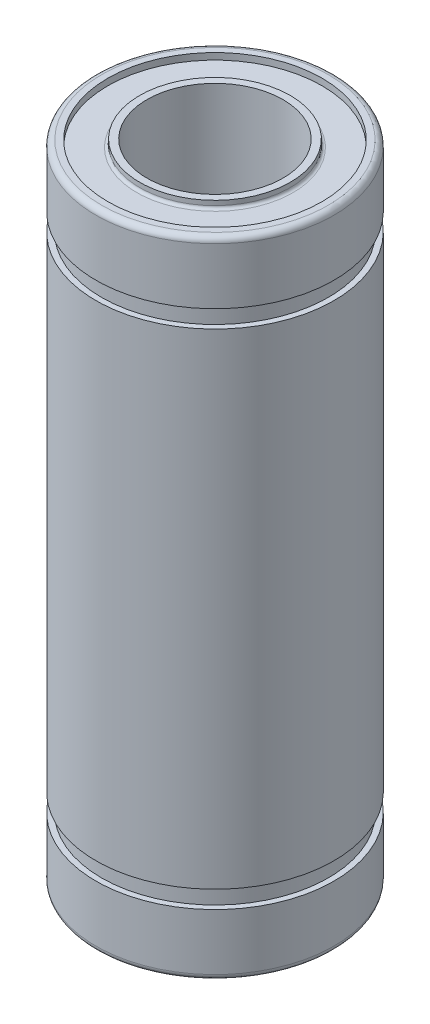
ISO-10303-21;
HEADER;
FILE_DESCRIPTION(('STEP AP214'),'2;1');
FILE_NAME('part.step','',(''),(''),'','','');
FILE_SCHEMA(('AUTOMOTIVE_DESIGN { 1 0 10303 214 1 1 1 1 }'));
ENDSEC;
DATA;
#1=APPLICATION_CONTEXT('core data for automotive mechanical design processes');
#2=APPLICATION_PROTOCOL_DEFINITION('international standard','automotive_design',2000,#1);
#3=PRODUCT_CONTEXT('',#1,'mechanical');
#4=PRODUCT('Part','Part','',(#3));
#5=PRODUCT_RELATED_PRODUCT_CATEGORY('part','',(#4));
#6=PRODUCT_DEFINITION_FORMATION('','',#4);
#7=PRODUCT_DEFINITION_CONTEXT('part definition',#1,'design');
#8=PRODUCT_DEFINITION('design','',#6,#7);
#9=PRODUCT_DEFINITION_SHAPE('','',#8);
#10=(LENGTH_UNIT() NAMED_UNIT(*) SI_UNIT(.MILLI.,.METRE.));
#11=(NAMED_UNIT(*) PLANE_ANGLE_UNIT() SI_UNIT($,.RADIAN.));
#12=(NAMED_UNIT(*) SI_UNIT($,.STERADIAN.) SOLID_ANGLE_UNIT());
#13=UNCERTAINTY_MEASURE_WITH_UNIT(LENGTH_MEASURE(1.E-05),#10,'distance_accuracy_value','');
#14=(GEOMETRIC_REPRESENTATION_CONTEXT(3) GLOBAL_UNCERTAINTY_ASSIGNED_CONTEXT((#13)) GLOBAL_UNIT_ASSIGNED_CONTEXT((#10,
#11,#12)) REPRESENTATION_CONTEXT('',''));
#15=CARTESIAN_POINT('',(0.,0.,0.));
#16=DIRECTION('',(0.,0.,1.));
#17=DIRECTION('',(1.,0.,0.));
#18=AXIS2_PLACEMENT_3D('',#15,#16,#17);
#19=CARTESIAN_POINT('',(0.,28.4804,0.));
#20=DIRECTION('',(0.,-1.,0.));
#21=DIRECTION('',(0.,0.,-1.));
#22=AXIS2_PLACEMENT_3D('',#19,#20,#21);
#23=CYLINDRICAL_SURFACE('',#22,6.635);
#24=CARTESIAN_POINT('',(0.,28.4804,0.));
#25=DIRECTION('',(0.,-1.,0.));
#26=DIRECTION('',(0.,0.,-1.));
#27=AXIS2_PLACEMENT_3D('',#24,#25,#26);
#28=CIRCLE('',#27,6.635);
#29=CARTESIAN_POINT('',(0.,28.4804,-6.635));
#30=VERTEX_POINT('',#29);
#31=EDGE_CURVE('E107',#30,#30,#28,.T.);
#32=ORIENTED_EDGE('',*,*,#31,.T.);
#33=EDGE_LOOP('',(#32));
#34=FACE_BOUND('',#33,.T.);
#35=CARTESIAN_POINT('',(0.,28.074,0.));
#36=DIRECTION('',(0.,-1.,0.));
#37=DIRECTION('',(0.,0.,-1.));
#38=AXIS2_PLACEMENT_3D('',#35,#36,#37);
#39=CIRCLE('',#38,6.635);
#40=CARTESIAN_POINT('',(0.,28.074,-6.635));
#41=VERTEX_POINT('',#40);
#42=EDGE_CURVE('E10',#41,#41,#39,.T.);
#43=ORIENTED_EDGE('',*,*,#42,.F.);
#44=EDGE_LOOP('',(#43));
#45=FACE_BOUND('',#44,.T.);
#46=ADVANCED_FACE('F31',(#34,#45),#23,.T.);
#47=CARTESIAN_POINT('',(0.,28.074,0.));
#48=DIRECTION('',(0.,-1.,0.));
#49=DIRECTION('',(0.,0.,-1.));
#50=AXIS2_PLACEMENT_3D('',#47,#48,#49);
#51=TOROIDAL_SURFACE('',#50,6.889,0.254);
#52=ORIENTED_EDGE('',*,*,#42,.T.);
#53=EDGE_LOOP('',(#52));
#54=FACE_BOUND('',#53,.T.);
#55=CARTESIAN_POINT('',(0.,27.82,0.));
#56=DIRECTION('',(0.,-1.,0.));
#57=DIRECTION('',(0.,0.,-1.));
#58=AXIS2_PLACEMENT_3D('',#55,#56,#57);
#59=CIRCLE('',#58,6.88900000000006);
#60=CARTESIAN_POINT('',(0.,27.82,-6.88900000000006));
#61=VERTEX_POINT('',#60);
#62=EDGE_CURVE('E37',#61,#61,#59,.T.);
#63=ORIENTED_EDGE('',*,*,#62,.F.);
#64=EDGE_LOOP('',(#63));
#65=FACE_BOUND('',#64,.T.);
#66=ADVANCED_FACE('F125',(#54,#65),#51,.F.);
#67=CARTESIAN_POINT('',(9.435,27.82,0.));
#68=DIRECTION('',(0.,1.,0.));
#69=DIRECTION('',(0.,0.,1.));
#70=AXIS2_PLACEMENT_3D('',#67,#68,#69);
#71=PLANE('',#70);
#72=ORIENTED_EDGE('',*,*,#62,.T.);
#73=EDGE_LOOP('',(#72));
#74=FACE_BOUND('',#73,.T.);
#75=CARTESIAN_POINT('',(0.,27.82,0.));
#76=DIRECTION('',(0.,-1.,0.));
#77=DIRECTION('',(0.,0.,-1.));
#78=AXIS2_PLACEMENT_3D('',#75,#76,#77);
#79=CIRCLE('',#78,9.435);
#80=CARTESIAN_POINT('',(0.,27.82,-9.435));
#81=VERTEX_POINT('',#80);
#82=EDGE_CURVE('E41',#81,#81,#79,.T.);
#83=ORIENTED_EDGE('',*,*,#82,.F.);
#84=EDGE_LOOP('',(#83));
#85=FACE_BOUND('',#84,.T.);
#86=ADVANCED_FACE('F129',(#74,#85),#71,.T.);
#87=CARTESIAN_POINT('',(0.,28.4804,0.));
#88=DIRECTION('',(0.,-1.,0.));
#89=DIRECTION('',(0.,0.,-1.));
#90=AXIS2_PLACEMENT_3D('',#87,#88,#89);
#91=CYLINDRICAL_SURFACE('',#90,9.435);
#92=ORIENTED_EDGE('',*,*,#82,.T.);
#93=EDGE_LOOP('',(#92));
#94=FACE_BOUND('',#93,.T.);
#95=CARTESIAN_POINT('',(0.,28.4,0.));
#96=DIRECTION('',(0.,-1.,0.));
#97=DIRECTION('',(0.,0.,-1.));
#98=AXIS2_PLACEMENT_3D('',#95,#96,#97);
#99=CIRCLE('',#98,9.435);
#100=CARTESIAN_POINT('',(0.,28.4,-9.435));
#101=VERTEX_POINT('',#100);
#102=EDGE_CURVE('E45',#101,#101,#99,.T.);
#103=ORIENTED_EDGE('',*,*,#102,.F.);
#104=EDGE_LOOP('',(#103));
#105=FACE_BOUND('',#104,.T.);
#106=ADVANCED_FACE('F133',(#94,#105),#91,.F.);
#107=CARTESIAN_POINT('',(9.982,28.4,0.));
#108=DIRECTION('',(0.,1.,0.));
#109=DIRECTION('',(0.,0.,1.));
#110=AXIS2_PLACEMENT_3D('',#107,#108,#109);
#111=PLANE('',#110);
#112=ORIENTED_EDGE('',*,*,#102,.T.);
#113=EDGE_LOOP('',(#112));
#114=FACE_BOUND('',#113,.T.);
#115=CARTESIAN_POINT('',(0.,28.4,0.));
#116=DIRECTION('',(0.,-1.,0.));
#117=DIRECTION('',(0.,0.,-1.));
#118=AXIS2_PLACEMENT_3D('',#115,#116,#117);
#119=CIRCLE('',#118,9.982);
#120=CARTESIAN_POINT('',(0.,28.4,-9.982));
#121=VERTEX_POINT('',#120);
#122=EDGE_CURVE('E50',#121,#121,#119,.T.);
#123=ORIENTED_EDGE('',*,*,#122,.F.);
#124=EDGE_LOOP('',(#123));
#125=FACE_BOUND('',#124,.T.);
#126=ADVANCED_FACE('F139',(#114,#125),#111,.T.);
#127=CARTESIAN_POINT('',(0.,27.892,0.));
#128=DIRECTION('',(0.,-1.,0.));
#129=DIRECTION('',(0.,0.,-1.));
#130=AXIS2_PLACEMENT_3D('',#127,#128,#129);
#131=TOROIDAL_SURFACE('',#130,9.982,0.508000000000001);
#132=ORIENTED_EDGE('',*,*,#122,.T.);
#133=EDGE_LOOP('',(#132));
#134=FACE_BOUND('',#133,.T.);
#135=CARTESIAN_POINT('',(0.,27.892,0.));
#136=DIRECTION('',(0.,-1.,0.));
#137=DIRECTION('',(0.,0.,-1.));
#138=AXIS2_PLACEMENT_3D('',#135,#136,#137);
#139=CIRCLE('',#138,10.49);
#140=CARTESIAN_POINT('',(0.,27.892,-10.49));
#141=VERTEX_POINT('',#140);
#142=EDGE_CURVE('E53',#141,#141,#139,.T.);
#143=ORIENTED_EDGE('',*,*,#142,.F.);
#144=EDGE_LOOP('',(#143));
#145=FACE_BOUND('',#144,.T.);
#146=ADVANCED_FACE('F143',(#134,#145),#131,.T.);
#147=CARTESIAN_POINT('',(0.,28.4804,0.));
#148=DIRECTION('',(0.,-1.,0.));
#149=DIRECTION('',(0.,0.,-1.));
#150=AXIS2_PLACEMENT_3D('',#147,#148,#149);
#151=CYLINDRICAL_SURFACE('',#150,10.49);
#152=ORIENTED_EDGE('',*,*,#142,.T.);
#153=EDGE_LOOP('',(#152));
#154=FACE_BOUND('',#153,.T.);
#155=CARTESIAN_POINT('',(0.,22.93,0.));
#156=DIRECTION('',(0.,-1.,0.));
#157=DIRECTION('',(0.,0.,-1.));
#158=AXIS2_PLACEMENT_3D('',#155,#156,#157);
#159=CIRCLE('',#158,10.49);
#160=CARTESIAN_POINT('',(0.,22.93,-10.49));
#161=VERTEX_POINT('',#160);
#162=EDGE_CURVE('E56',#161,#161,#159,.T.);
#163=ORIENTED_EDGE('',*,*,#162,.F.);
#164=EDGE_LOOP('',(#163));
#165=FACE_BOUND('',#164,.T.);
#166=ADVANCED_FACE('F147',(#154,#165),#151,.T.);
#167=CARTESIAN_POINT('',(10.,22.93,0.));
#168=DIRECTION('',(0.,-1.,0.));
#169=DIRECTION('',(0.,0.,-1.));
#170=AXIS2_PLACEMENT_3D('',#167,#168,#169);
#171=PLANE('',#170);
#172=ORIENTED_EDGE('',*,*,#162,.T.);
#173=EDGE_LOOP('',(#172));
#174=FACE_BOUND('',#173,.T.);
#175=CARTESIAN_POINT('',(0.,22.93,0.));
#176=DIRECTION('',(0.,-1.,0.));
#177=DIRECTION('',(0.,0.,-1.));
#178=AXIS2_PLACEMENT_3D('',#175,#176,#177);
#179=CIRCLE('',#178,10.);
#180=CARTESIAN_POINT('',(0.,22.93,-10.));
#181=VERTEX_POINT('',#180);
#182=EDGE_CURVE('E59',#181,#181,#179,.T.);
#183=ORIENTED_EDGE('',*,*,#182,.F.);
#184=EDGE_LOOP('',(#183));
#185=FACE_BOUND('',#184,.T.);
#186=ADVANCED_FACE('F151',(#174,#185),#171,.T.);
#187=CARTESIAN_POINT('',(0.,28.4804,0.));
#188=DIRECTION('',(0.,-1.,0.));
#189=DIRECTION('',(0.,0.,-1.));
#190=AXIS2_PLACEMENT_3D('',#187,#188,#189);
#191=CYLINDRICAL_SURFACE('',#190,10.);
#192=ORIENTED_EDGE('',*,*,#182,.T.);
#193=EDGE_LOOP('',(#192));
#194=FACE_BOUND('',#193,.T.);
#195=CARTESIAN_POINT('',(0.,21.38,0.));
#196=DIRECTION('',(0.,-1.,0.));
#197=DIRECTION('',(0.,0.,-1.));
#198=AXIS2_PLACEMENT_3D('',#195,#196,#197);
#199=CIRCLE('',#198,10.);
#200=CARTESIAN_POINT('',(0.,21.38,-10.));
#201=VERTEX_POINT('',#200);
#202=EDGE_CURVE('E62',#201,#201,#199,.T.);
#203=ORIENTED_EDGE('',*,*,#202,.F.);
#204=EDGE_LOOP('',(#203));
#205=FACE_BOUND('',#204,.T.);
#206=ADVANCED_FACE('F155',(#194,#205),#191,.T.);
#207=CARTESIAN_POINT('',(10.49,21.38,0.));
#208=DIRECTION('',(0.,1.,0.));
#209=DIRECTION('',(0.,0.,1.));
#210=AXIS2_PLACEMENT_3D('',#207,#208,#209);
#211=PLANE('',#210);
#212=ORIENTED_EDGE('',*,*,#202,.T.);
#213=EDGE_LOOP('',(#212));
#214=FACE_BOUND('',#213,.T.);
#215=CARTESIAN_POINT('',(0.,21.38,0.));
#216=DIRECTION('',(0.,-1.,0.));
#217=DIRECTION('',(0.,0.,-1.));
#218=AXIS2_PLACEMENT_3D('',#215,#216,#217);
#219=CIRCLE('',#218,10.49);
#220=CARTESIAN_POINT('',(0.,21.38,-10.49));
#221=VERTEX_POINT('',#220);
#222=EDGE_CURVE('E65',#221,#221,#219,.T.);
#223=ORIENTED_EDGE('',*,*,#222,.F.);
#224=EDGE_LOOP('',(#223));
#225=FACE_BOUND('',#224,.T.);
#226=ADVANCED_FACE('F159',(#214,#225),#211,.T.);
#227=CARTESIAN_POINT('',(0.,28.4804,0.));
#228=DIRECTION('',(0.,-1.,0.));
#229=DIRECTION('',(0.,0.,-1.));
#230=AXIS2_PLACEMENT_3D('',#227,#228,#229);
#231=CYLINDRICAL_SURFACE('',#230,10.49);
#232=ORIENTED_EDGE('',*,*,#222,.T.);
#233=EDGE_LOOP('',(#232));
#234=FACE_BOUND('',#233,.T.);
#235=CARTESIAN_POINT('',(0.,-21.38,0.));
#236=DIRECTION('',(0.,-1.,0.));
#237=DIRECTION('',(0.,0.,-1.));
#238=AXIS2_PLACEMENT_3D('',#235,#236,#237);
#239=CIRCLE('',#238,10.49);
#240=CARTESIAN_POINT('',(0.,-21.38,-10.49));
#241=VERTEX_POINT('',#240);
#242=EDGE_CURVE('E68',#241,#241,#239,.T.);
#243=ORIENTED_EDGE('',*,*,#242,.F.);
#244=EDGE_LOOP('',(#243));
#245=FACE_BOUND('',#244,.T.);
#246=ADVANCED_FACE('F163',(#234,#245),#231,.T.);
#247=CARTESIAN_POINT('',(10.,-21.38,0.));
#248=DIRECTION('',(0.,-1.,0.));
#249=DIRECTION('',(0.,0.,-1.));
#250=AXIS2_PLACEMENT_3D('',#247,#248,#249);
#251=PLANE('',#250);
#252=ORIENTED_EDGE('',*,*,#242,.T.);
#253=EDGE_LOOP('',(#252));
#254=FACE_BOUND('',#253,.T.);
#255=CARTESIAN_POINT('',(0.,-21.38,0.));
#256=DIRECTION('',(0.,-1.,0.));
#257=DIRECTION('',(0.,0.,-1.));
#258=AXIS2_PLACEMENT_3D('',#255,#256,#257);
#259=CIRCLE('',#258,10.);
#260=CARTESIAN_POINT('',(0.,-21.38,-10.));
#261=VERTEX_POINT('',#260);
#262=EDGE_CURVE('E71',#261,#261,#259,.T.);
#263=ORIENTED_EDGE('',*,*,#262,.F.);
#264=EDGE_LOOP('',(#263));
#265=FACE_BOUND('',#264,.T.);
#266=ADVANCED_FACE('F167',(#254,#265),#251,.T.);
#267=CARTESIAN_POINT('',(0.,28.4804,0.));
#268=DIRECTION('',(0.,-1.,0.));
#269=DIRECTION('',(0.,0.,-1.));
#270=AXIS2_PLACEMENT_3D('',#267,#268,#269);
#271=CYLINDRICAL_SURFACE('',#270,10.);
#272=ORIENTED_EDGE('',*,*,#262,.T.);
#273=EDGE_LOOP('',(#272));
#274=FACE_BOUND('',#273,.T.);
#275=CARTESIAN_POINT('',(0.,-22.93,0.));
#276=DIRECTION('',(0.,-1.,0.));
#277=DIRECTION('',(0.,0.,-1.));
#278=AXIS2_PLACEMENT_3D('',#275,#276,#277);
#279=CIRCLE('',#278,10.);
#280=CARTESIAN_POINT('',(0.,-22.93,-10.));
#281=VERTEX_POINT('',#280);
#282=EDGE_CURVE('E74',#281,#281,#279,.T.);
#283=ORIENTED_EDGE('',*,*,#282,.F.);
#284=EDGE_LOOP('',(#283));
#285=FACE_BOUND('',#284,.T.);
#286=ADVANCED_FACE('F171',(#274,#285),#271,.T.);
#287=CARTESIAN_POINT('',(10.49,-22.93,0.));
#288=DIRECTION('',(0.,1.,0.));
#289=DIRECTION('',(0.,0.,1.));
#290=AXIS2_PLACEMENT_3D('',#287,#288,#289);
#291=PLANE('',#290);
#292=ORIENTED_EDGE('',*,*,#282,.T.);
#293=EDGE_LOOP('',(#292));
#294=FACE_BOUND('',#293,.T.);
#295=CARTESIAN_POINT('',(0.,-22.93,0.));
#296=DIRECTION('',(0.,-1.,0.));
#297=DIRECTION('',(0.,0.,-1.));
#298=AXIS2_PLACEMENT_3D('',#295,#296,#297);
#299=CIRCLE('',#298,10.49);
#300=CARTESIAN_POINT('',(0.,-22.93,-10.49));
#301=VERTEX_POINT('',#300);
#302=EDGE_CURVE('E77',#301,#301,#299,.T.);
#303=ORIENTED_EDGE('',*,*,#302,.F.);
#304=EDGE_LOOP('',(#303));
#305=FACE_BOUND('',#304,.T.);
#306=ADVANCED_FACE('F175',(#294,#305),#291,.T.);
#307=CARTESIAN_POINT('',(0.,28.4804,0.));
#308=DIRECTION('',(0.,-1.,0.));
#309=DIRECTION('',(0.,0.,-1.));
#310=AXIS2_PLACEMENT_3D('',#307,#308,#309);
#311=CYLINDRICAL_SURFACE('',#310,10.49);
#312=ORIENTED_EDGE('',*,*,#302,.T.);
#313=EDGE_LOOP('',(#312));
#314=FACE_BOUND('',#313,.T.);
#315=CARTESIAN_POINT('',(0.,-27.892,0.));
#316=DIRECTION('',(0.,-1.,0.));
#317=DIRECTION('',(0.,0.,-1.));
#318=AXIS2_PLACEMENT_3D('',#315,#316,#317);
#319=CIRCLE('',#318,10.49);
#320=CARTESIAN_POINT('',(0.,-27.892,-10.49));
#321=VERTEX_POINT('',#320);
#322=EDGE_CURVE('E80',#321,#321,#319,.T.);
#323=ORIENTED_EDGE('',*,*,#322,.F.);
#324=EDGE_LOOP('',(#323));
#325=FACE_BOUND('',#324,.T.);
#326=ADVANCED_FACE('F179',(#314,#325),#311,.T.);
#327=CARTESIAN_POINT('',(0.,-27.892,0.));
#328=DIRECTION('',(0.,-1.,0.));
#329=DIRECTION('',(0.,0.,-1.));
#330=AXIS2_PLACEMENT_3D('',#327,#328,#329);
#331=TOROIDAL_SURFACE('',#330,9.982,0.508000000000001);
#332=ORIENTED_EDGE('',*,*,#322,.T.);
#333=EDGE_LOOP('',(#332));
#334=FACE_BOUND('',#333,.T.);
#335=CARTESIAN_POINT('',(0.,-28.4,0.));
#336=DIRECTION('',(0.,-1.,0.));
#337=DIRECTION('',(0.,0.,-1.));
#338=AXIS2_PLACEMENT_3D('',#335,#336,#337);
#339=CIRCLE('',#338,9.98200000000004);
#340=CARTESIAN_POINT('',(0.,-28.4,-9.98200000000004));
#341=VERTEX_POINT('',#340);
#342=EDGE_CURVE('E83',#341,#341,#339,.T.);
#343=ORIENTED_EDGE('',*,*,#342,.F.);
#344=EDGE_LOOP('',(#343));
#345=FACE_BOUND('',#344,.T.);
#346=ADVANCED_FACE('F183',(#334,#345),#331,.T.);
#347=CARTESIAN_POINT('',(9.435,-28.4,0.));
#348=DIRECTION('',(0.,-1.,0.));
#349=DIRECTION('',(0.,0.,-1.));
#350=AXIS2_PLACEMENT_3D('',#347,#348,#349);
#351=PLANE('',#350);
#352=ORIENTED_EDGE('',*,*,#342,.T.);
#353=EDGE_LOOP('',(#352));
#354=FACE_BOUND('',#353,.T.);
#355=CARTESIAN_POINT('',(0.,-28.4,0.));
#356=DIRECTION('',(0.,-1.,0.));
#357=DIRECTION('',(0.,0.,-1.));
#358=AXIS2_PLACEMENT_3D('',#355,#356,#357);
#359=CIRCLE('',#358,9.435);
#360=CARTESIAN_POINT('',(0.,-28.4,-9.435));
#361=VERTEX_POINT('',#360);
#362=EDGE_CURVE('E86',#361,#361,#359,.T.);
#363=ORIENTED_EDGE('',*,*,#362,.F.);
#364=EDGE_LOOP('',(#363));
#365=FACE_BOUND('',#364,.T.);
#366=ADVANCED_FACE('F187',(#354,#365),#351,.T.);
#367=CARTESIAN_POINT('',(0.,28.4804,0.));
#368=DIRECTION('',(0.,-1.,0.));
#369=DIRECTION('',(0.,0.,-1.));
#370=AXIS2_PLACEMENT_3D('',#367,#368,#369);
#371=CYLINDRICAL_SURFACE('',#370,9.435);
#372=ORIENTED_EDGE('',*,*,#362,.T.);
#373=EDGE_LOOP('',(#372));
#374=FACE_BOUND('',#373,.T.);
#375=CARTESIAN_POINT('',(0.,-27.82,0.));
#376=DIRECTION('',(0.,-1.,0.));
#377=DIRECTION('',(0.,0.,-1.));
#378=AXIS2_PLACEMENT_3D('',#375,#376,#377);
#379=CIRCLE('',#378,9.435);
#380=CARTESIAN_POINT('',(0.,-27.82,-9.435));
#381=VERTEX_POINT('',#380);
#382=EDGE_CURVE('E89',#381,#381,#379,.T.);
#383=ORIENTED_EDGE('',*,*,#382,.F.);
#384=EDGE_LOOP('',(#383));
#385=FACE_BOUND('',#384,.T.);
#386=ADVANCED_FACE('F191',(#374,#385),#371,.F.);
#387=CARTESIAN_POINT('',(6.889,-27.82,0.));
#388=DIRECTION('',(0.,-1.,0.));
#389=DIRECTION('',(0.,0.,-1.));
#390=AXIS2_PLACEMENT_3D('',#387,#388,#389);
#391=PLANE('',#390);
#392=ORIENTED_EDGE('',*,*,#382,.T.);
#393=EDGE_LOOP('',(#392));
#394=FACE_BOUND('',#393,.T.);
#395=CARTESIAN_POINT('',(0.,-27.82,0.));
#396=DIRECTION('',(0.,-1.,0.));
#397=DIRECTION('',(0.,0.,-1.));
#398=AXIS2_PLACEMENT_3D('',#395,#396,#397);
#399=CIRCLE('',#398,6.889);
#400=CARTESIAN_POINT('',(0.,-27.82,-6.889));
#401=VERTEX_POINT('',#400);
#402=EDGE_CURVE('E92',#401,#401,#399,.T.);
#403=ORIENTED_EDGE('',*,*,#402,.F.);
#404=EDGE_LOOP('',(#403));
#405=FACE_BOUND('',#404,.T.);
#406=ADVANCED_FACE('F195',(#394,#405),#391,.T.);
#407=CARTESIAN_POINT('',(0.,-28.074,0.));
#408=DIRECTION('',(0.,-1.,0.));
#409=DIRECTION('',(0.,0.,-1.));
#410=AXIS2_PLACEMENT_3D('',#407,#408,#409);
#411=TOROIDAL_SURFACE('',#410,6.889,0.254);
#412=ORIENTED_EDGE('',*,*,#402,.T.);
#413=EDGE_LOOP('',(#412));
#414=FACE_BOUND('',#413,.T.);
#415=CARTESIAN_POINT('',(0.,-28.074,0.));
#416=DIRECTION('',(0.,-1.,0.));
#417=DIRECTION('',(0.,0.,-1.));
#418=AXIS2_PLACEMENT_3D('',#415,#416,#417);
#419=CIRCLE('',#418,6.635);
#420=CARTESIAN_POINT('',(0.,-28.074,-6.635));
#421=VERTEX_POINT('',#420);
#422=EDGE_CURVE('E95',#421,#421,#419,.T.);
#423=ORIENTED_EDGE('',*,*,#422,.F.);
#424=EDGE_LOOP('',(#423));
#425=FACE_BOUND('',#424,.T.);
#426=ADVANCED_FACE('F199',(#414,#425),#411,.F.);
#427=CARTESIAN_POINT('',(0.,28.4804,0.));
#428=DIRECTION('',(0.,-1.,0.));
#429=DIRECTION('',(0.,0.,-1.));
#430=AXIS2_PLACEMENT_3D('',#427,#428,#429);
#431=CYLINDRICAL_SURFACE('',#430,6.635);
#432=ORIENTED_EDGE('',*,*,#422,.T.);
#433=EDGE_LOOP('',(#432));
#434=FACE_BOUND('',#433,.T.);
#435=CARTESIAN_POINT('',(0.,-28.4804,0.));
#436=DIRECTION('',(0.,-1.,0.));
#437=DIRECTION('',(0.,0.,-1.));
#438=AXIS2_PLACEMENT_3D('',#435,#436,#437);
#439=CIRCLE('',#438,6.635);
#440=CARTESIAN_POINT('',(0.,-28.4804,-6.635));
#441=VERTEX_POINT('',#440);
#442=EDGE_CURVE('E98',#441,#441,#439,.T.);
#443=ORIENTED_EDGE('',*,*,#442,.F.);
#444=EDGE_LOOP('',(#443));
#445=FACE_BOUND('',#444,.T.);
#446=ADVANCED_FACE('F203',(#434,#445),#431,.T.);
#447=CARTESIAN_POINT('',(6.,-28.4804,0.));
#448=DIRECTION('',(0.,-1.,0.));
#449=DIRECTION('',(0.,0.,-1.));
#450=AXIS2_PLACEMENT_3D('',#447,#448,#449);
#451=PLANE('',#450);
#452=ORIENTED_EDGE('',*,*,#442,.T.);
#453=EDGE_LOOP('',(#452));
#454=FACE_BOUND('',#453,.T.);
#455=CARTESIAN_POINT('',(0.,-28.4804,0.));
#456=DIRECTION('',(0.,-1.,0.));
#457=DIRECTION('',(0.,0.,-1.));
#458=AXIS2_PLACEMENT_3D('',#455,#456,#457);
#459=CIRCLE('',#458,6.);
#460=CARTESIAN_POINT('',(0.,-28.4804,-6.));
#461=VERTEX_POINT('',#460);
#462=EDGE_CURVE('E101',#461,#461,#459,.T.);
#463=ORIENTED_EDGE('',*,*,#462,.F.);
#464=EDGE_LOOP('',(#463));
#465=FACE_BOUND('',#464,.T.);
#466=ADVANCED_FACE('F121',(#454,#465),#451,.T.);
#467=CARTESIAN_POINT('',(0.,28.4804,0.));
#468=DIRECTION('',(0.,-1.,0.));
#469=DIRECTION('',(0.,0.,-1.));
#470=AXIS2_PLACEMENT_3D('',#467,#468,#469);
#471=CYLINDRICAL_SURFACE('',#470,6.);
#472=ORIENTED_EDGE('',*,*,#462,.T.);
#473=EDGE_LOOP('',(#472));
#474=FACE_BOUND('',#473,.T.);
#475=CARTESIAN_POINT('',(0.,28.4804,0.));
#476=DIRECTION('',(0.,-1.,0.));
#477=DIRECTION('',(0.,0.,-1.));
#478=AXIS2_PLACEMENT_3D('',#475,#476,#477);
#479=CIRCLE('',#478,6.);
#480=CARTESIAN_POINT('',(0.,28.4804,-6.));
#481=VERTEX_POINT('',#480);
#482=EDGE_CURVE('E104',#481,#481,#479,.T.);
#483=ORIENTED_EDGE('',*,*,#482,.F.);
#484=EDGE_LOOP('',(#483));
#485=FACE_BOUND('',#484,.T.);
#486=ADVANCED_FACE('F115',(#474,#485),#471,.F.);
#487=CARTESIAN_POINT('',(6.635,28.4804,0.));
#488=DIRECTION('',(0.,1.,0.));
#489=DIRECTION('',(0.,0.,1.));
#490=AXIS2_PLACEMENT_3D('',#487,#488,#489);
#491=PLANE('',#490);
#492=ORIENTED_EDGE('',*,*,#482,.T.);
#493=EDGE_LOOP('',(#492));
#494=FACE_BOUND('',#493,.T.);
#495=ORIENTED_EDGE('',*,*,#31,.F.);
#496=EDGE_LOOP('',(#495));
#497=FACE_BOUND('',#496,.T.);
#498=ADVANCED_FACE('F113',(#494,#497),#491,.T.);
#499=CLOSED_SHELL('',(#46,#66,#86,#106,#126,#146,#166,#186,#206,#226,#246,#266,#286,#306,#326,
#346,#366,#386,#406,#426,#446,#466,#486,#498));
#500=MANIFOLD_SOLID_BREP('B2',#499);
#501=ADVANCED_BREP_SHAPE_REPRESENTATION('',(#18,#500),#14);
#502=SHAPE_DEFINITION_REPRESENTATION(#9,#501);
ENDSEC;
END-ISO-10303-21;
